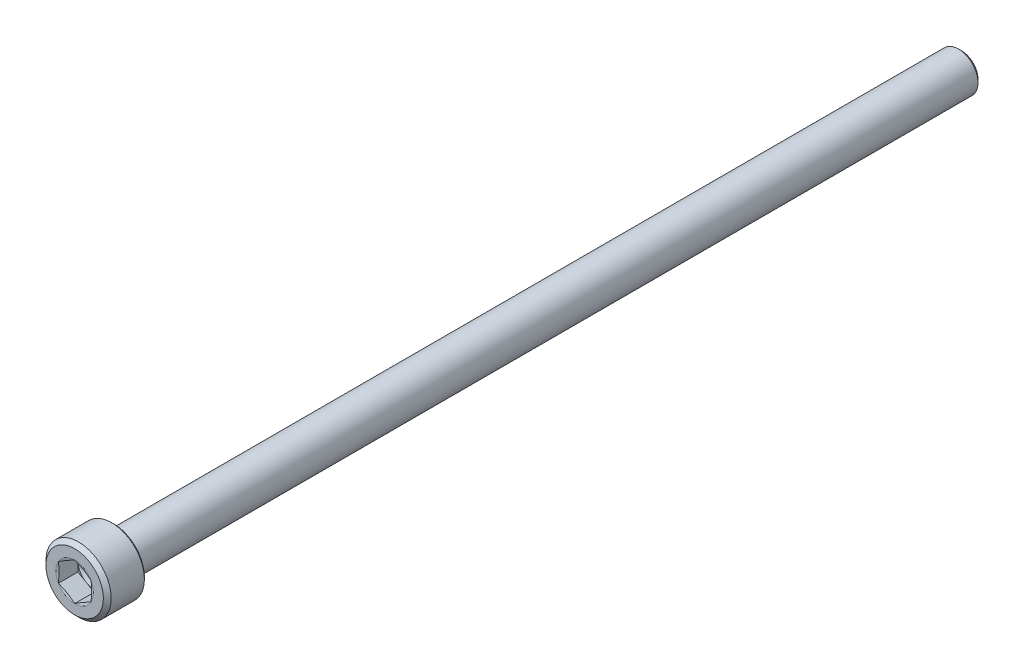
ISO-10303-21;
HEADER;
FILE_DESCRIPTION(('STEP AP214'),'2;1');
FILE_NAME('part.step','',(''),(''),'','','');
FILE_SCHEMA(('AUTOMOTIVE_DESIGN { 1 0 10303 214 1 1 1 1 }'));
ENDSEC;
DATA;
#1=APPLICATION_CONTEXT('core data for automotive mechanical design processes');
#2=APPLICATION_PROTOCOL_DEFINITION('international standard','automotive_design',2000,#1);
#3=PRODUCT_CONTEXT('',#1,'mechanical');
#4=PRODUCT('Part','Part','',(#3));
#5=PRODUCT_RELATED_PRODUCT_CATEGORY('part','',(#4));
#6=PRODUCT_DEFINITION_FORMATION('','',#4);
#7=PRODUCT_DEFINITION_CONTEXT('part definition',#1,'design');
#8=PRODUCT_DEFINITION('design','',#6,#7);
#9=PRODUCT_DEFINITION_SHAPE('','',#8);
#10=(LENGTH_UNIT() NAMED_UNIT(*) SI_UNIT(.MILLI.,.METRE.));
#11=(NAMED_UNIT(*) PLANE_ANGLE_UNIT() SI_UNIT($,.RADIAN.));
#12=(NAMED_UNIT(*) SI_UNIT($,.STERADIAN.) SOLID_ANGLE_UNIT());
#13=UNCERTAINTY_MEASURE_WITH_UNIT(LENGTH_MEASURE(1.E-05),#10,'distance_accuracy_value','');
#14=(GEOMETRIC_REPRESENTATION_CONTEXT(3) GLOBAL_UNCERTAINTY_ASSIGNED_CONTEXT((#13)) GLOBAL_UNIT_ASSIGNED_CONTEXT((#10,
#11,#12)) REPRESENTATION_CONTEXT('',''));
#15=CARTESIAN_POINT('',(0.,0.,0.));
#16=DIRECTION('',(0.,0.,1.));
#17=DIRECTION('',(1.,0.,0.));
#18=AXIS2_PLACEMENT_3D('',#15,#16,#17);
#19=CARTESIAN_POINT('',(0.,0.,0.));
#20=DIRECTION('',(0.,0.,-1.));
#21=DIRECTION('',(-1.,0.,0.));
#22=AXIS2_PLACEMENT_3D('',#19,#20,#21);
#23=PLANE('',#22);
#24=CARTESIAN_POINT('',(0.,0.,0.));
#25=DIRECTION('',(0.,0.,1.));
#26=DIRECTION('',(1.,0.,0.));
#27=AXIS2_PLACEMENT_3D('',#24,#25,#26);
#28=CIRCLE('',#27,4.4);
#29=CARTESIAN_POINT('',(4.4,0.,0.));
#30=VERTEX_POINT('',#29);
#31=EDGE_CURVE('E232',#30,#30,#28,.T.);
#32=ORIENTED_EDGE('',*,*,#31,.T.);
#33=EDGE_LOOP('',(#32));
#34=FACE_BOUND('',#33,.T.);
#35=CARTESIAN_POINT('',(0.,0.,0.));
#36=DIRECTION('',(0.,0.,1.));
#37=DIRECTION('',(1.,0.,0.));
#38=AXIS2_PLACEMENT_3D('',#35,#36,#37);
#39=CIRCLE('',#38,2.88675134594813);
#40=CARTESIAN_POINT('',(-2.5,-1.44337567297407,0.));
#41=VERTEX_POINT('',#40);
#42=CARTESIAN_POINT('',(0.,-2.88675134594813,0.));
#43=VERTEX_POINT('',#42);
#44=EDGE_CURVE('E158',#41,#43,#39,.T.);
#45=ORIENTED_EDGE('',*,*,#44,.F.);
#46=CARTESIAN_POINT('',(-2.5,1.44337567297407,0.));
#47=VERTEX_POINT('',#46);
#48=EDGE_CURVE('E157',#47,#41,#39,.T.);
#49=ORIENTED_EDGE('',*,*,#48,.F.);
#50=CARTESIAN_POINT('',(0.,2.88675134594813,0.));
#51=VERTEX_POINT('',#50);
#52=EDGE_CURVE('E124',#51,#47,#39,.T.);
#53=ORIENTED_EDGE('',*,*,#52,.F.);
#54=CARTESIAN_POINT('',(2.5,1.44337567297407,0.));
#55=VERTEX_POINT('',#54);
#56=EDGE_CURVE('E118',#55,#51,#39,.T.);
#57=ORIENTED_EDGE('',*,*,#56,.F.);
#58=CARTESIAN_POINT('',(2.5,-1.44337567297406,0.));
#59=VERTEX_POINT('',#58);
#60=EDGE_CURVE('E126',#59,#55,#39,.T.);
#61=ORIENTED_EDGE('',*,*,#60,.F.);
#62=EDGE_CURVE('E316',#43,#59,#39,.T.);
#63=ORIENTED_EDGE('',*,*,#62,.F.);
#64=EDGE_LOOP('',(#45,#49,#53,#57,#61,#63));
#65=FACE_BOUND('',#64,.T.);
#66=ADVANCED_FACE('F41',(#34,#65),#23,.F.);
#67=CARTESIAN_POINT('',(0.,0.,-0.599999999999999));
#68=DIRECTION('',(0.,0.,-1.));
#69=DIRECTION('',(-1.,0.,0.));
#70=AXIS2_PLACEMENT_3D('',#67,#68,#69);
#71=CONICAL_SURFACE('',#70,5.,0.78539816339745);
#72=ORIENTED_EDGE('',*,*,#31,.F.);
#73=EDGE_LOOP('',(#72));
#74=FACE_BOUND('',#73,.T.);
#75=CARTESIAN_POINT('',(0.,0.,-0.599999999999999));
#76=DIRECTION('',(0.,0.,1.));
#77=DIRECTION('',(1.,0.,0.));
#78=AXIS2_PLACEMENT_3D('',#75,#76,#77);
#79=CIRCLE('',#78,5.);
#80=CARTESIAN_POINT('',(5.,0.,-0.599999999999999));
#81=VERTEX_POINT('',#80);
#82=EDGE_CURVE('E234',#81,#81,#79,.T.);
#83=ORIENTED_EDGE('',*,*,#82,.T.);
#84=EDGE_LOOP('',(#83));
#85=FACE_BOUND('',#84,.T.);
#86=ADVANCED_FACE('F223',(#74,#85),#71,.T.);
#87=CARTESIAN_POINT('',(0.,0.,0.));
#88=DIRECTION('',(0.,0.,1.));
#89=DIRECTION('',(1.,0.,0.));
#90=AXIS2_PLACEMENT_3D('',#87,#88,#89);
#91=CYLINDRICAL_SURFACE('',#90,5.);
#92=ORIENTED_EDGE('',*,*,#82,.F.);
#93=EDGE_LOOP('',(#92));
#94=FACE_BOUND('',#93,.T.);
#95=CARTESIAN_POINT('',(0.,0.,-5.69));
#96=DIRECTION('',(0.,0.,1.));
#97=DIRECTION('',(1.,0.,0.));
#98=AXIS2_PLACEMENT_3D('',#95,#96,#97);
#99=CIRCLE('',#98,5.);
#100=CARTESIAN_POINT('',(5.,0.,-5.69));
#101=VERTEX_POINT('',#100);
#102=EDGE_CURVE('E237',#101,#101,#99,.T.);
#103=ORIENTED_EDGE('',*,*,#102,.T.);
#104=EDGE_LOOP('',(#103));
#105=FACE_BOUND('',#104,.T.);
#106=ADVANCED_FACE('F228',(#94,#105),#91,.T.);
#107=CARTESIAN_POINT('',(0.,0.,-6.));
#108=DIRECTION('',(0.,0.,1.));
#109=DIRECTION('',(1.,0.,0.));
#110=AXIS2_PLACEMENT_3D('',#107,#108,#109);
#111=CONICAL_SURFACE('',#110,4.69,0.785398163397452);
#112=ORIENTED_EDGE('',*,*,#102,.F.);
#113=EDGE_LOOP('',(#112));
#114=FACE_BOUND('',#113,.T.);
#115=CARTESIAN_POINT('',(0.,0.,-6.));
#116=DIRECTION('',(0.,0.,1.));
#117=DIRECTION('',(1.,0.,0.));
#118=AXIS2_PLACEMENT_3D('',#115,#116,#117);
#119=CIRCLE('',#118,4.69);
#120=CARTESIAN_POINT('',(4.69,0.,-6.));
#121=VERTEX_POINT('',#120);
#122=EDGE_CURVE('E242',#121,#121,#119,.T.);
#123=ORIENTED_EDGE('',*,*,#122,.T.);
#124=EDGE_LOOP('',(#123));
#125=FACE_BOUND('',#124,.T.);
#126=ADVANCED_FACE('F432',(#114,#125),#111,.T.);
#127=CARTESIAN_POINT('',(0.,4.69,-6.));
#128=DIRECTION('',(0.,0.,1.));
#129=DIRECTION('',(1.,0.,0.));
#130=AXIS2_PLACEMENT_3D('',#127,#128,#129);
#131=PLANE('',#130);
#132=ORIENTED_EDGE('',*,*,#122,.F.);
#133=EDGE_LOOP('',(#132));
#134=FACE_BOUND('',#133,.T.);
#135=CARTESIAN_POINT('',(0.,0.,-6.));
#136=DIRECTION('',(0.,0.,1.));
#137=DIRECTION('',(1.,0.,0.));
#138=AXIS2_PLACEMENT_3D('',#135,#136,#137);
#139=CIRCLE('',#138,3.4);
#140=CARTESIAN_POINT('',(3.4,0.,-6.));
#141=VERTEX_POINT('',#140);
#142=EDGE_CURVE('E245',#141,#141,#139,.T.);
#143=ORIENTED_EDGE('',*,*,#142,.T.);
#144=EDGE_LOOP('',(#143));
#145=FACE_BOUND('',#144,.T.);
#146=ADVANCED_FACE('F424',(#134,#145),#131,.F.);
#147=CARTESIAN_POINT('',(0.,0.,-6.25));
#148=DIRECTION('',(0.,0.,1.));
#149=DIRECTION('',(1.,0.,0.));
#150=AXIS2_PLACEMENT_3D('',#147,#148,#149);
#151=TOROIDAL_SURFACE('',#150,3.4,0.249999999999999);
#152=ORIENTED_EDGE('',*,*,#142,.F.);
#153=EDGE_LOOP('',(#152));
#154=FACE_BOUND('',#153,.T.);
#155=CARTESIAN_POINT('',(0.,0.,-6.16765696092043));
#156=DIRECTION('',(0.,0.,1.));
#157=DIRECTION('',(1.,0.,0.));
#158=AXIS2_PLACEMENT_3D('',#155,#156,#157);
#159=CIRCLE('',#158,3.16394995463856);
#160=CARTESIAN_POINT('',(3.16394995463856,0.,-6.16765696092043));
#161=VERTEX_POINT('',#160);
#162=EDGE_CURVE('E248',#161,#161,#159,.T.);
#163=ORIENTED_EDGE('',*,*,#162,.T.);
#164=EDGE_LOOP('',(#163));
#165=FACE_BOUND('',#164,.T.);
#166=ADVANCED_FACE('F416',(#154,#165),#151,.F.);
#167=CARTESIAN_POINT('',(0.,0.,-6.59765696092043));
#168=DIRECTION('',(0.,0.,1.));
#169=DIRECTION('',(1.,0.,0.));
#170=AXIS2_PLACEMENT_3D('',#167,#168,#169);
#171=CONICAL_SURFACE('',#170,3.01394995463856,0.335638550327612);
#172=ORIENTED_EDGE('',*,*,#162,.F.);
#173=EDGE_LOOP('',(#172));
#174=FACE_BOUND('',#173,.T.);
#175=CARTESIAN_POINT('',(0.,0.,-6.59765696092043));
#176=DIRECTION('',(0.,0.,1.));
#177=DIRECTION('',(1.,0.,0.));
#178=AXIS2_PLACEMENT_3D('',#175,#176,#177);
#179=CIRCLE('',#178,3.01394995463856);
#180=CARTESIAN_POINT('',(3.01394995463856,0.,-6.59765696092043));
#181=VERTEX_POINT('',#180);
#182=EDGE_CURVE('E251',#181,#181,#179,.T.);
#183=ORIENTED_EDGE('',*,*,#182,.T.);
#184=EDGE_LOOP('',(#183));
#185=FACE_BOUND('',#184,.T.);
#186=ADVANCED_FACE('F408',(#174,#185),#171,.T.);
#187=CARTESIAN_POINT('',(0.,0.,-6.68));
#188=DIRECTION('',(0.,0.,1.));
#189=DIRECTION('',(1.,0.,0.));
#190=AXIS2_PLACEMENT_3D('',#187,#188,#189);
#191=TOROIDAL_SURFACE('',#190,3.25,0.25);
#192=ORIENTED_EDGE('',*,*,#182,.F.);
#193=EDGE_LOOP('',(#192));
#194=FACE_BOUND('',#193,.T.);
#195=CARTESIAN_POINT('',(0.,0.,-6.68));
#196=DIRECTION('',(0.,0.,1.));
#197=DIRECTION('',(1.,0.,0.));
#198=AXIS2_PLACEMENT_3D('',#195,#196,#197);
#199=CIRCLE('',#198,3.);
#200=CARTESIAN_POINT('',(3.,0.,-6.68));
#201=VERTEX_POINT('',#200);
#202=EDGE_CURVE('E254',#201,#201,#199,.T.);
#203=ORIENTED_EDGE('',*,*,#202,.T.);
#204=EDGE_LOOP('',(#203));
#205=FACE_BOUND('',#204,.T.);
#206=ADVANCED_FACE('F400',(#194,#205),#191,.F.);
#207=CARTESIAN_POINT('',(0.,0.,0.));
#208=DIRECTION('',(0.,0.,1.));
#209=DIRECTION('',(1.,0.,0.));
#210=AXIS2_PLACEMENT_3D('',#207,#208,#209);
#211=CYLINDRICAL_SURFACE('',#210,3.);
#212=ORIENTED_EDGE('',*,*,#202,.F.);
#213=EDGE_LOOP('',(#212));
#214=FACE_BOUND('',#213,.T.);
#215=CARTESIAN_POINT('',(0.,0.,-135.5));
#216=DIRECTION('',(0.,0.,1.));
#217=DIRECTION('',(1.,0.,0.));
#218=AXIS2_PLACEMENT_3D('',#215,#216,#217);
#219=CIRCLE('',#218,3.);
#220=CARTESIAN_POINT('',(3.,0.,-135.5));
#221=VERTEX_POINT('',#220);
#222=EDGE_CURVE('E257',#221,#221,#219,.T.);
#223=ORIENTED_EDGE('',*,*,#222,.T.);
#224=EDGE_LOOP('',(#223));
#225=FACE_BOUND('',#224,.T.);
#226=ADVANCED_FACE('F391',(#214,#225),#211,.T.);
#227=CARTESIAN_POINT('',(0.,0.,-136.));
#228=DIRECTION('',(0.,0.,1.));
#229=DIRECTION('',(1.,0.,0.));
#230=AXIS2_PLACEMENT_3D('',#227,#228,#229);
#231=CONICAL_SURFACE('',#230,2.5,0.78539816339742);
#232=ORIENTED_EDGE('',*,*,#222,.F.);
#233=EDGE_LOOP('',(#232));
#234=FACE_BOUND('',#233,.T.);
#235=CARTESIAN_POINT('',(0.,0.,-136.));
#236=DIRECTION('',(0.,0.,1.));
#237=DIRECTION('',(1.,0.,0.));
#238=AXIS2_PLACEMENT_3D('',#235,#236,#237);
#239=CIRCLE('',#238,2.5);
#240=CARTESIAN_POINT('',(2.5,0.,-136.));
#241=VERTEX_POINT('',#240);
#242=EDGE_CURVE('E260',#241,#241,#239,.T.);
#243=ORIENTED_EDGE('',*,*,#242,.T.);
#244=EDGE_LOOP('',(#243));
#245=FACE_BOUND('',#244,.T.);
#246=ADVANCED_FACE('F383',(#234,#245),#231,.T.);
#247=CARTESIAN_POINT('',(0.,2.5,-136.));
#248=DIRECTION('',(0.,0.,1.));
#249=DIRECTION('',(1.,0.,0.));
#250=AXIS2_PLACEMENT_3D('',#247,#248,#249);
#251=PLANE('',#250);
#252=ORIENTED_EDGE('',*,*,#242,.F.);
#253=EDGE_LOOP('',(#252));
#254=FACE_BOUND('',#253,.T.);
#255=ADVANCED_FACE('F377',(#254),#251,.F.);
#256=CARTESIAN_POINT('',(0.,0.,-0.103629710818449));
#257=DIRECTION('',(0.,0.,1.));
#258=DIRECTION('',(1.,0.,0.));
#259=AXIS2_PLACEMENT_3D('',#256,#257,#258);
#260=CONICAL_SURFACE('',#259,2.5,1.30899693899575);
#261=ORIENTED_EDGE('',*,*,#52,.T.);
#262=CARTESIAN_POINT('',(-2.5002,1.44326020292023,3.09419640078327E-05));
#263=CARTESIAN_POINT('',(-2.3963647277611,1.50320952529874,-0.0160404315877912));
#264=CARTESIAN_POINT('',(-2.29234116960921,1.56326755459979,-0.0306306771178117));
#265=CARTESIAN_POINT('',(-2.08392662601295,1.68359574744812,-0.0562644794602667));
#266=CARTESIAN_POINT('',(-1.97953550863948,1.74386598716471,-0.0673065951638286));
#267=CARTESIAN_POINT('',(-1.77101887822002,1.8642531198679,-0.0851994090604318));
#268=CARTESIAN_POINT('',(-1.66689477566614,1.9243691985065,-0.0920714486702324));
#269=CARTESIAN_POINT('',(-1.45851376233156,2.04467803264923,-0.101286161227743));
#270=CARTESIAN_POINT('',(-1.35425688116578,2.10487077105516,-0.103629710818448));
#271=CARTESIAN_POINT('',(-1.14574311883422,2.22525624786703,-0.103629710818448));
#272=CARTESIAN_POINT('',(-1.04148623766843,2.28544898627297,-0.101286161227743));
#273=CARTESIAN_POINT('',(-0.833105224333855,2.4057578204157,-0.0920714486702323));
#274=CARTESIAN_POINT('',(-0.728981121779983,2.4658738990543,-0.0851994090604318));
#275=CARTESIAN_POINT('',(-0.520464491360523,2.58626103175749,-0.0673065951638284));
#276=CARTESIAN_POINT('',(-0.416073373987047,2.64653127147407,-0.0562644794602665));
#277=CARTESIAN_POINT('',(-0.207658830390791,2.7668594643224,-0.0306306771178115));
#278=CARTESIAN_POINT('',(-0.103635272238903,2.82691749362346,-0.016040431587791));
#279=CARTESIAN_POINT('',(0.000200000000000633,2.88686681600197,3.09419640079173E-05));
#280=B_SPLINE_CURVE_WITH_KNOTS('',3,(#262,#263,#264,#265,#266,#267,#268,#269,#270,#271,#272,
#273,#274,#275,#276,#277,#278,#279),.UNSPECIFIED.,.F.,.F.,(4,2,2,2,2,2,2,2,4),(0.,
0.362931913815158,0.726011050322838,1.08721601235603,1.44835104389736,1.80948607543869,
2.17069103747188,2.53377017397956,2.89670208779472),.UNSPECIFIED.);
#281=EDGE_CURVE('E11',#47,#51,#280,.T.);
#282=ORIENTED_EDGE('',*,*,#281,.T.);
#283=EDGE_LOOP('',(#261,#282));
#284=FACE_BOUND('',#283,.T.);
#285=ADVANCED_FACE('F130',(#284),#260,.F.);
#286=CARTESIAN_POINT('',(-2.5,-3.81607528745377,0.448898750822263));
#287=CARTESIAN_POINT('',(-2.5,-3.70268222589733,0.423490022888473));
#288=CARTESIAN_POINT('',(-2.5,-3.58921822823278,0.398392881364473));
#289=CARTESIAN_POINT('',(-2.5,-3.36211340745449,0.348988750788404));
#290=CARTESIAN_POINT('',(-2.5,-3.24847257691113,0.324681795929632));
#291=CARTESIAN_POINT('',(-2.5,-3.02087703769944,0.277003803109804));
#292=CARTESIAN_POINT('',(-2.5,-2.90692213022999,0.253633709391547));
#293=CARTESIAN_POINT('',(-2.5,-2.67877535679218,0.208086780880581));
#294=CARTESIAN_POINT('',(-2.5,-2.56458349283676,0.185909935993961));
#295=CARTESIAN_POINT('',(-2.5,-2.22341982425459,0.121910877106936));
#296=CARTESIAN_POINT('',(-2.5,-1.99603830218398,0.0822302229364124));
#297=CARTESIAN_POINT('',(-2.5,-1.53988771892966,0.0116720496175827));
#298=CARTESIAN_POINT('',(-2.5,-1.31111890637465,-0.0192070019485673));
#299=CARTESIAN_POINT('',(-2.5,-0.965612085480585,-0.0559642465078483));
#300=CARTESIAN_POINT('',(-2.5,-0.849388361737326,-0.0666558282512374));
#301=CARTESIAN_POINT('',(-2.5,-0.616655377132936,-0.0842009570846986));
#302=CARTESIAN_POINT('',(-2.5,-0.500146141574661,-0.0910548327485627));
#303=CARTESIAN_POINT('',(-2.5,-0.267001550599814,-0.100527089710495));
#304=CARTESIAN_POINT('',(-2.5,-0.150366269056388,-0.103147255321986));
#305=CARTESIAN_POINT('',(-2.5,0.0829204090002316,-0.10399028327093));
#306=CARTESIAN_POINT('',(-2.5,0.199571805500895,-0.102213149008376));
#307=CARTESIAN_POINT('',(-2.5,0.433147940164822,-0.09436195748554));
#308=CARTESIAN_POINT('',(-2.5,0.550072149359405,-0.0882724452898564));
#309=CARTESIAN_POINT('',(-2.5,0.783651629721234,-0.0721426206173039));
#310=CARTESIAN_POINT('',(-2.5,0.900306876564898,-0.0621019639074798));
#311=CARTESIAN_POINT('',(-2.5,1.24987827661572,-0.0268172856222201));
#312=CARTESIAN_POINT('',(-2.5,1.48227255568164,0.00358412310984416));
#313=CARTESIAN_POINT('',(-2.5,1.93002655518119,0.0714138007905057));
#314=CARTESIAN_POINT('',(-2.5,2.14548347256994,0.108234090127695));
#315=CARTESIAN_POINT('',(-2.5,2.57541124173799,0.187324733638172));
#316=CARTESIAN_POINT('',(-2.5,2.78988196550051,0.229595775775308));
#317=CARTESIAN_POINT('',(-2.5,3.2181052382832,0.317793502316737));
#318=CARTESIAN_POINT('',(-2.5,3.43185763378042,0.363720922081292));
#319=CARTESIAN_POINT('',(-2.5,3.85881275448637,0.458069959265328));
#320=CARTESIAN_POINT('',(-2.5,4.07201546822918,0.506491628277899));
#321=CARTESIAN_POINT('',(-2.5,4.49591231305092,0.604599288732733));
#322=CARTESIAN_POINT('',(-2.5,4.70661044026336,0.654268092023149));
#323=CARTESIAN_POINT('',(-2.5,5.12771281191888,0.754849972800793));
#324=CARTESIAN_POINT('',(-2.5,5.33811705095724,0.80576307286073));
#325=CARTESIAN_POINT('',(-2.5,5.75844185155037,0.908445331221202));
#326=CARTESIAN_POINT('',(-2.5,5.96836268971444,0.960213359733673));
#327=CARTESIAN_POINT('',(-2.5,6.38802143165175,1.06445683710807));
#328=CARTESIAN_POINT('',(-2.5,6.59775934122022,1.11693226262348));
#329=CARTESIAN_POINT('',(-2.5,6.80743348121522,1.16965832285731));
#330=B_SPLINE_CURVE_WITH_KNOTS('',3,(#286,#287,#288,#289,#290,#291,#292,#293,#294,#295,#296,
#297,#298,#299,#300,#301,#302,#303,#304,#305,#306,#307,#308,#309,#310,#311,#312,#313,#314,#315,
#316,#317,#318,#319,#320,#321,#322,#323,#324,#325,#326,#327,#328,#329),.UNSPECIFIED.,.F.,.F.,(4,
2,2,2,2,2,2,2,2,2,2,2,2,2,2,2,2,2,2,2,2,4),(0.,0.348615963150093,0.697246991733421,
1.04622099004378,1.39519203585453,2.08754680874317,2.77978096430401,3.12987133055866,
3.47993171845836,3.82984453354037,4.17975707806977,4.53093004646434,4.88213361664562,
5.58492300307792,6.24058068113987,6.89632119383297,7.55219392197656,8.20808022217989,
8.85749522889879,9.50692202537157,10.155550152628,10.8041569250998),.UNSPECIFIED.);
#331=EDGE_CURVE('E123',#41,#47,#330,.T.);
#332=ORIENTED_EDGE('',*,*,#331,.T.);
#333=ORIENTED_EDGE('',*,*,#48,.T.);
#334=EDGE_LOOP('',(#332,#333));
#335=FACE_BOUND('',#334,.T.);
#336=ADVANCED_FACE('F364',(#335),#260,.F.);
#337=CARTESIAN_POINT('',(0.000199999999999656,-2.88686681600197,3.09419640072472E-05));
#338=CARTESIAN_POINT('',(-0.103635272238904,-2.82691749362346,-0.0160404315877918));
#339=CARTESIAN_POINT('',(-0.207658830390792,-2.7668594643224,-0.0306306771178123));
#340=CARTESIAN_POINT('',(-0.416073373987048,-2.64653127147407,-0.0562644794602673));
#341=CARTESIAN_POINT('',(-0.520464491360523,-2.58626103175749,-0.0673065951638292));
#342=CARTESIAN_POINT('',(-0.728981121779984,-2.4658738990543,-0.0851994090604324));
#343=CARTESIAN_POINT('',(-0.833105224333855,-2.40575782041569,-0.0920714486702329));
#344=CARTESIAN_POINT('',(-1.04148623766843,-2.28544898627297,-0.101286161227744));
#345=CARTESIAN_POINT('',(-1.14574311883422,-2.22525624786703,-0.103629710818449));
#346=CARTESIAN_POINT('',(-1.35425688116578,-2.10487077105516,-0.103629710818449));
#347=CARTESIAN_POINT('',(-1.45851376233157,-2.04467803264922,-0.101286161227744));
#348=CARTESIAN_POINT('',(-1.66689477566614,-1.9243691985065,-0.092071448670233));
#349=CARTESIAN_POINT('',(-1.77101887822002,-1.86425311986789,-0.0851994090604324));
#350=CARTESIAN_POINT('',(-1.97953550863948,-1.7438659871647,-0.0673065951638292));
#351=CARTESIAN_POINT('',(-2.08392662601295,-1.68359574744812,-0.0562644794602673));
#352=CARTESIAN_POINT('',(-2.29234116960921,-1.56326755459979,-0.0306306771178123));
#353=CARTESIAN_POINT('',(-2.3963647277611,-1.50320952529873,-0.0160404315877917));
#354=CARTESIAN_POINT('',(-2.5002,-1.44326020292023,3.0941964007367E-05));
#355=B_SPLINE_CURVE_WITH_KNOTS('',3,(#337,#338,#339,#340,#341,#342,#343,#344,#345,#346,#347,
#348,#349,#350,#351,#352,#353,#354),.UNSPECIFIED.,.F.,.F.,(4,2,2,2,2,2,2,2,4),(0.,
0.362931913815158,0.726011050322838,1.08721601235603,1.44835104389736,1.80948607543869,
2.17069103747188,2.53377017397956,2.89670208779472),.UNSPECIFIED.);
#356=EDGE_CURVE('E166',#43,#41,#355,.T.);
#357=ORIENTED_EDGE('',*,*,#356,.T.);
#358=ORIENTED_EDGE('',*,*,#44,.T.);
#359=EDGE_LOOP('',(#357,#358));
#360=FACE_BOUND('',#359,.T.);
#361=ADVANCED_FACE('F358',(#360),#260,.F.);
#362=CARTESIAN_POINT('',(2.5002,-1.44326020292023,3.09419640074895E-05));
#363=CARTESIAN_POINT('',(2.3963647277611,-1.50320952529874,-0.0160404315877914));
#364=CARTESIAN_POINT('',(2.29234116960921,-1.56326755459979,-0.030630677117812));
#365=CARTESIAN_POINT('',(2.08392662601295,-1.68359574744812,-0.0562644794602671));
#366=CARTESIAN_POINT('',(1.97953550863948,-1.7438659871647,-0.067306595163829));
#367=CARTESIAN_POINT('',(1.77101887822002,-1.86425311986789,-0.0851994090604323));
#368=CARTESIAN_POINT('',(1.66689477566614,-1.9243691985065,-0.0920714486702328));
#369=CARTESIAN_POINT('',(1.45851376233157,-2.04467803264922,-0.101286161227744));
#370=CARTESIAN_POINT('',(1.35425688116578,-2.10487077105516,-0.103629710818449));
#371=CARTESIAN_POINT('',(1.14574311883422,-2.22525624786703,-0.103629710818449));
#372=CARTESIAN_POINT('',(1.04148623766843,-2.28544898627297,-0.101286161227744));
#373=CARTESIAN_POINT('',(0.833105224333855,-2.40575782041569,-0.0920714486702329));
#374=CARTESIAN_POINT('',(0.728981121779984,-2.4658738990543,-0.0851994090604324));
#375=CARTESIAN_POINT('',(0.520464491360523,-2.58626103175749,-0.0673065951638292));
#376=CARTESIAN_POINT('',(0.416073373987048,-2.64653127147407,-0.0562644794602673));
#377=CARTESIAN_POINT('',(0.207658830390792,-2.7668594643224,-0.0306306771178124));
#378=CARTESIAN_POINT('',(0.103635272238904,-2.82691749362346,-0.0160404315877919));
#379=CARTESIAN_POINT('',(-0.000199999999999934,-2.88686681600197,3.09419640071601E-05));
#380=B_SPLINE_CURVE_WITH_KNOTS('',3,(#362,#363,#364,#365,#366,#367,#368,#369,#370,#371,#372,
#373,#374,#375,#376,#377,#378,#379),.UNSPECIFIED.,.F.,.F.,(4,2,2,2,2,2,2,2,4),(0.,
0.362931913815159,0.726011050322838,1.08721601235603,1.44835104389736,1.80948607543869,
2.17069103747188,2.53377017397956,2.89670208779472),.UNSPECIFIED.);
#381=EDGE_CURVE('E186',#59,#43,#380,.T.);
#382=ORIENTED_EDGE('',*,*,#381,.T.);
#383=ORIENTED_EDGE('',*,*,#62,.T.);
#384=EDGE_LOOP('',(#382,#383));
#385=FACE_BOUND('',#384,.T.);
#386=ADVANCED_FACE('F352',(#385),#260,.F.);
#387=CARTESIAN_POINT('',(2.5,-3.81607528745378,0.448898750822263));
#388=CARTESIAN_POINT('',(2.5,-3.70268222589733,0.423490022888473));
#389=CARTESIAN_POINT('',(2.5,-3.58921822823278,0.398392881364473));
#390=CARTESIAN_POINT('',(2.5,-3.36211340745449,0.348988750788405));
#391=CARTESIAN_POINT('',(2.5,-3.24847257691113,0.324681795929633));
#392=CARTESIAN_POINT('',(2.5,-3.02087703769944,0.277003803109804));
#393=CARTESIAN_POINT('',(2.5,-2.90692213023,0.253633709391547));
#394=CARTESIAN_POINT('',(2.5,-2.67877535679218,0.208086780880582));
#395=CARTESIAN_POINT('',(2.5,-2.56458349283676,0.185909935993962));
#396=CARTESIAN_POINT('',(2.5,-2.22341982425459,0.121910877106936));
#397=CARTESIAN_POINT('',(2.5,-1.99603830218398,0.0822302229364126));
#398=CARTESIAN_POINT('',(2.5,-1.53988771892967,0.0116720496175827));
#399=CARTESIAN_POINT('',(2.5,-1.31111890637465,-0.0192070019485672));
#400=CARTESIAN_POINT('',(2.5,-0.965612085480586,-0.0559642465078481));
#401=CARTESIAN_POINT('',(2.5,-0.849388361737327,-0.0666558282512373));
#402=CARTESIAN_POINT('',(2.5,-0.616655377132937,-0.0842009570846985));
#403=CARTESIAN_POINT('',(2.5,-0.500146141574662,-0.0910548327485627));
#404=CARTESIAN_POINT('',(2.5,-0.267001550599815,-0.100527089710495));
#405=CARTESIAN_POINT('',(2.5,-0.150366269056389,-0.103147255321986));
#406=CARTESIAN_POINT('',(2.5,0.0829204090002306,-0.10399028327093));
#407=CARTESIAN_POINT('',(2.5,0.199571805500894,-0.102213149008376));
#408=CARTESIAN_POINT('',(2.5,0.433147940164821,-0.09436195748554));
#409=CARTESIAN_POINT('',(2.5,0.550072149359404,-0.0882724452898564));
#410=CARTESIAN_POINT('',(2.5,0.783651629721233,-0.0721426206173039));
#411=CARTESIAN_POINT('',(2.5,0.900306876564897,-0.0621019639074799));
#412=CARTESIAN_POINT('',(2.5,1.24987827661571,-0.0268172856222202));
#413=CARTESIAN_POINT('',(2.5,1.48227255568164,0.00358412310984413));
#414=CARTESIAN_POINT('',(2.5,1.93002655518119,0.0714138007905059));
#415=CARTESIAN_POINT('',(2.5,2.14548347256994,0.108234090127695));
#416=CARTESIAN_POINT('',(2.5,2.57541124173799,0.187324733638172));
#417=CARTESIAN_POINT('',(2.5,2.78988196550051,0.229595775775308));
#418=CARTESIAN_POINT('',(2.5,3.21810523828321,0.317793502316737));
#419=CARTESIAN_POINT('',(2.5,3.43185763378042,0.363720922081293));
#420=CARTESIAN_POINT('',(2.5,3.85881275448638,0.458069959265329));
#421=CARTESIAN_POINT('',(2.5,4.07201546822918,0.5064916282779));
#422=CARTESIAN_POINT('',(2.5,4.49591231305093,0.604599288732734));
#423=CARTESIAN_POINT('',(2.5,4.70661044026336,0.65426809202315));
#424=CARTESIAN_POINT('',(2.5,5.12771281191888,0.754849972800793));
#425=CARTESIAN_POINT('',(2.5,5.33811705095724,0.80576307286073));
#426=CARTESIAN_POINT('',(2.5,5.75844185155038,0.908445331221202));
#427=CARTESIAN_POINT('',(2.5,5.96836268971444,0.960213359733673));
#428=CARTESIAN_POINT('',(2.5,6.38802143165175,1.06445683710807));
#429=CARTESIAN_POINT('',(2.5,6.59775934122022,1.11693226262348));
#430=CARTESIAN_POINT('',(2.5,6.80743348121522,1.16965832285731));
#431=B_SPLINE_CURVE_WITH_KNOTS('',3,(#387,#388,#389,#390,#391,#392,#393,#394,#395,#396,#397,
#398,#399,#400,#401,#402,#403,#404,#405,#406,#407,#408,#409,#410,#411,#412,#413,#414,#415,#416,
#417,#418,#419,#420,#421,#422,#423,#424,#425,#426,#427,#428,#429,#430),.UNSPECIFIED.,.F.,.F.,(4,
2,2,2,2,2,2,2,2,2,2,2,2,2,2,2,2,2,2,2,2,4),(0.,0.348615963150093,0.697246991733421,
1.04622099004378,1.39519203585453,2.08754680874317,2.77978096430401,3.12987133055866,
3.47993171845836,3.82984453354037,4.17975707806977,4.53093004646434,4.88213361664562,
5.58492300307792,6.24058068113987,6.89632119383297,7.55219392197657,8.20808022217989,
8.85749522889879,9.50692202537157,10.155550152628,10.8041569250998),.UNSPECIFIED.);
#432=EDGE_CURVE('E66',#55,#59,#431,.F.);
#433=ORIENTED_EDGE('',*,*,#432,.T.);
#434=ORIENTED_EDGE('',*,*,#60,.T.);
#435=EDGE_LOOP('',(#433,#434));
#436=FACE_BOUND('',#435,.T.);
#437=ADVANCED_FACE('F179',(#436),#260,.F.);
#438=CARTESIAN_POINT('',(-0.000199999999999234,2.88686681600197,3.09419640079894E-05));
#439=CARTESIAN_POINT('',(0.103635272238905,2.82691749362346,-0.0160404315877909));
#440=CARTESIAN_POINT('',(0.207658830390793,2.7668594643224,-0.0306306771178115));
#441=CARTESIAN_POINT('',(0.416073373987049,2.64653127147407,-0.0562644794602665));
#442=CARTESIAN_POINT('',(0.520464491360524,2.58626103175749,-0.0673065951638284));
#443=CARTESIAN_POINT('',(0.728981121779984,2.4658738990543,-0.0851994090604317));
#444=CARTESIAN_POINT('',(0.833105224333856,2.4057578204157,-0.0920714486702322));
#445=CARTESIAN_POINT('',(1.04148623766844,2.28544898627297,-0.101286161227743));
#446=CARTESIAN_POINT('',(1.14574311883422,2.22525624786703,-0.103629710818448));
#447=CARTESIAN_POINT('',(1.35425688116578,2.10487077105516,-0.103629710818448));
#448=CARTESIAN_POINT('',(1.45851376233157,2.04467803264923,-0.101286161227743));
#449=CARTESIAN_POINT('',(1.66689477566614,1.9243691985065,-0.0920714486702323));
#450=CARTESIAN_POINT('',(1.77101887822002,1.8642531198679,-0.0851994090604318));
#451=CARTESIAN_POINT('',(1.97953550863948,1.74386598716471,-0.0673065951638286));
#452=CARTESIAN_POINT('',(2.08392662601295,1.68359574744812,-0.0562644794602666));
#453=CARTESIAN_POINT('',(2.29234116960921,1.56326755459979,-0.0306306771178116));
#454=CARTESIAN_POINT('',(2.3963647277611,1.50320952529874,-0.016040431587791));
#455=CARTESIAN_POINT('',(2.5002,1.44326020292023,3.09419640078353E-05));
#456=B_SPLINE_CURVE_WITH_KNOTS('',3,(#438,#439,#440,#441,#442,#443,#444,#445,#446,#447,#448,
#449,#450,#451,#452,#453,#454,#455),.UNSPECIFIED.,.F.,.F.,(4,2,2,2,2,2,2,2,4),(0.,
0.362931913815158,0.726011050322838,1.08721601235603,1.44835104389736,1.80948607543869,
2.17069103747188,2.53377017397956,2.89670208779472),.UNSPECIFIED.);
#457=EDGE_CURVE('E60',#51,#55,#456,.T.);
#458=ORIENTED_EDGE('',*,*,#457,.T.);
#459=ORIENTED_EDGE('',*,*,#56,.T.);
#460=EDGE_LOOP('',(#458,#459));
#461=FACE_BOUND('',#460,.T.);
#462=ADVANCED_FACE('F119',(#461),#260,.F.);
#463=CARTESIAN_POINT('',(0.,0.,-4.44337567297406));
#464=DIRECTION('',(0.,0.,1.));
#465=DIRECTION('',(1.,0.,0.));
#466=AXIS2_PLACEMENT_3D('',#463,#464,#465);
#467=CONICAL_SURFACE('',#466,0.,1.0471975511966);
#468=CARTESIAN_POINT('',(0.,0.,-3.));
#469=DIRECTION('',(0.,0.,1.));
#470=DIRECTION('',(1.,0.,0.));
#471=AXIS2_PLACEMENT_3D('',#468,#469,#470);
#472=CIRCLE('',#471,2.5);
#473=CARTESIAN_POINT('',(2.5,0.,-3.));
#474=VERTEX_POINT('',#473);
#475=CARTESIAN_POINT('',(1.25,2.1650635094611,-3.));
#476=VERTEX_POINT('',#475);
#477=EDGE_CURVE('E146',#474,#476,#472,.T.);
#478=ORIENTED_EDGE('',*,*,#477,.T.);
#479=CARTESIAN_POINT('',(-1.25,2.1650635094611,-3.));
#480=VERTEX_POINT('',#479);
#481=EDGE_CURVE('E54',#476,#480,#472,.T.);
#482=ORIENTED_EDGE('',*,*,#481,.T.);
#483=CARTESIAN_POINT('',(-2.5,0.,-3.));
#484=VERTEX_POINT('',#483);
#485=EDGE_CURVE('E297',#480,#484,#472,.T.);
#486=ORIENTED_EDGE('',*,*,#485,.T.);
#487=CARTESIAN_POINT('',(-1.25,-2.1650635094611,-3.));
#488=VERTEX_POINT('',#487);
#489=EDGE_CURVE('E299',#484,#488,#472,.T.);
#490=ORIENTED_EDGE('',*,*,#489,.T.);
#491=CARTESIAN_POINT('',(1.25,-2.1650635094611,-3.));
#492=VERTEX_POINT('',#491);
#493=EDGE_CURVE('E235',#488,#492,#472,.T.);
#494=ORIENTED_EDGE('',*,*,#493,.T.);
#495=EDGE_CURVE('E233',#492,#474,#472,.T.);
#496=ORIENTED_EDGE('',*,*,#495,.T.);
#497=EDGE_LOOP('',(#478,#482,#486,#490,#494,#496));
#498=FACE_BOUND('',#497,.T.);
#499=CARTESIAN_POINT('',(0.,0.,-4.44337567297406));
#500=VERTEX_POINT('',#499);
#501=VERTEX_LOOP('',#500);
#502=FACE_BOUND('',#501,.T.);
#503=ADVANCED_FACE('F178',(#498,#502),#467,.F.);
#504=CARTESIAN_POINT('',(0.,0.,-3.));
#505=DIRECTION('',(0.,0.,1.));
#506=DIRECTION('',(1.,0.,0.));
#507=AXIS2_PLACEMENT_3D('',#504,#505,#506);
#508=PLANE('',#507);
#509=ORIENTED_EDGE('',*,*,#477,.F.);
#510=DIRECTION('',(0.,1.,0.));
#511=VECTOR('',#510,1.);
#512=CARTESIAN_POINT('',(2.5,-1.44337567297406,-3.));
#513=LINE('',#512,#511);
#514=CARTESIAN_POINT('',(2.5,1.44337567297407,-3.));
#515=VERTEX_POINT('',#514);
#516=EDGE_CURVE('E276',#474,#515,#513,.T.);
#517=ORIENTED_EDGE('',*,*,#516,.T.);
#518=DIRECTION('',(-0.866025403784439,0.5,0.));
#519=VECTOR('',#518,1.);
#520=CARTESIAN_POINT('',(2.5,1.44337567297407,-3.));
#521=LINE('',#520,#519);
#522=EDGE_CURVE('E291',#515,#476,#521,.T.);
#523=ORIENTED_EDGE('',*,*,#522,.T.);
#524=EDGE_LOOP('',(#509,#517,#523));
#525=FACE_BOUND('',#524,.T.);
#526=ADVANCED_FACE('F321',(#525),#508,.T.);
#527=ORIENTED_EDGE('',*,*,#495,.F.);
#528=DIRECTION('',(0.866025403784439,0.5,0.));
#529=VECTOR('',#528,1.);
#530=CARTESIAN_POINT('',(0.,-2.88675134594813,-3.));
#531=LINE('',#530,#529);
#532=CARTESIAN_POINT('',(2.5,-1.44337567297406,-3.));
#533=VERTEX_POINT('',#532);
#534=EDGE_CURVE('E280',#492,#533,#531,.T.);
#535=ORIENTED_EDGE('',*,*,#534,.T.);
#536=EDGE_CURVE('E153',#533,#474,#513,.T.);
#537=ORIENTED_EDGE('',*,*,#536,.T.);
#538=EDGE_LOOP('',(#527,#535,#537));
#539=FACE_BOUND('',#538,.T.);
#540=ADVANCED_FACE('F209',(#539),#508,.T.);
#541=ORIENTED_EDGE('',*,*,#493,.F.);
#542=DIRECTION('',(0.866025403784439,-0.5,0.));
#543=VECTOR('',#542,1.);
#544=CARTESIAN_POINT('',(-2.5,-1.44337567297406,-3.));
#545=LINE('',#544,#543);
#546=CARTESIAN_POINT('',(0.,-2.88675134594813,-3.));
#547=VERTEX_POINT('',#546);
#548=EDGE_CURVE('E284',#488,#547,#545,.T.);
#549=ORIENTED_EDGE('',*,*,#548,.T.);
#550=EDGE_CURVE('E277',#547,#492,#531,.T.);
#551=ORIENTED_EDGE('',*,*,#550,.T.);
#552=EDGE_LOOP('',(#541,#549,#551));
#553=FACE_BOUND('',#552,.T.);
#554=ADVANCED_FACE('F312',(#553),#508,.T.);
#555=ORIENTED_EDGE('',*,*,#489,.F.);
#556=DIRECTION('',(0.,-1.,0.));
#557=VECTOR('',#556,1.);
#558=CARTESIAN_POINT('',(-2.5,1.44337567297407,-3.));
#559=LINE('',#558,#557);
#560=CARTESIAN_POINT('',(-2.5,-1.44337567297406,-3.));
#561=VERTEX_POINT('',#560);
#562=EDGE_CURVE('E288',#484,#561,#559,.T.);
#563=ORIENTED_EDGE('',*,*,#562,.T.);
#564=EDGE_CURVE('E281',#561,#488,#545,.T.);
#565=ORIENTED_EDGE('',*,*,#564,.T.);
#566=EDGE_LOOP('',(#555,#563,#565));
#567=FACE_BOUND('',#566,.T.);
#568=ADVANCED_FACE('F326',(#567),#508,.T.);
#569=ORIENTED_EDGE('',*,*,#481,.F.);
#570=CARTESIAN_POINT('',(0.,2.88675134594813,-3.));
#571=VERTEX_POINT('',#570);
#572=EDGE_CURVE('E293',#476,#571,#521,.T.);
#573=ORIENTED_EDGE('',*,*,#572,.T.);
#574=DIRECTION('',(-0.866025403784439,-0.5,0.));
#575=VECTOR('',#574,1.);
#576=CARTESIAN_POINT('',(0.,2.88675134594813,-3.));
#577=LINE('',#576,#575);
#578=EDGE_CURVE('E151',#571,#480,#577,.T.);
#579=ORIENTED_EDGE('',*,*,#578,.T.);
#580=EDGE_LOOP('',(#569,#573,#579));
#581=FACE_BOUND('',#580,.T.);
#582=ADVANCED_FACE('F323',(#581),#508,.T.);
#583=ORIENTED_EDGE('',*,*,#485,.F.);
#584=CARTESIAN_POINT('',(-2.5,1.44337567297407,-3.));
#585=VERTEX_POINT('',#584);
#586=EDGE_CURVE('E290',#480,#585,#577,.T.);
#587=ORIENTED_EDGE('',*,*,#586,.T.);
#588=EDGE_CURVE('E285',#585,#484,#559,.T.);
#589=ORIENTED_EDGE('',*,*,#588,.T.);
#590=EDGE_LOOP('',(#583,#587,#589));
#591=FACE_BOUND('',#590,.T.);
#592=ADVANCED_FACE('F325',(#591),#508,.T.);
#593=CARTESIAN_POINT('',(0.,2.88675134594813,-3.));
#594=DIRECTION('',(-0.5,0.866025403784439,0.));
#595=DIRECTION('',(-0.866025403784439,-0.5,0.));
#596=AXIS2_PLACEMENT_3D('',#593,#594,#595);
#597=PLANE('',#596);
#598=ORIENTED_EDGE('',*,*,#281,.F.);
#599=DIRECTION('',(0.,0.,1.));
#600=VECTOR('',#599,1.);
#601=CARTESIAN_POINT('',(-2.5,1.44337567297407,-3.));
#602=LINE('',#601,#600);
#603=EDGE_CURVE('E152',#585,#47,#602,.T.);
#604=ORIENTED_EDGE('',*,*,#603,.F.);
#605=ORIENTED_EDGE('',*,*,#586,.F.);
#606=ORIENTED_EDGE('',*,*,#578,.F.);
#607=DIRECTION('',(0.,0.,1.));
#608=VECTOR('',#607,1.);
#609=CARTESIAN_POINT('',(0.,2.88675134594813,-3.));
#610=LINE('',#609,#608);
#611=EDGE_CURVE('E141',#571,#51,#610,.T.);
#612=ORIENTED_EDGE('',*,*,#611,.T.);
#613=EDGE_LOOP('',(#598,#604,#605,#606,#612));
#614=FACE_BOUND('',#613,.T.);
#615=ADVANCED_FACE('F148',(#614),#597,.F.);
#616=CARTESIAN_POINT('',(-2.5,1.44337567297407,-3.));
#617=DIRECTION('',(-1.,0.,0.));
#618=DIRECTION('',(0.,0.,1.));
#619=AXIS2_PLACEMENT_3D('',#616,#617,#618);
#620=PLANE('',#619);
#621=ORIENTED_EDGE('',*,*,#331,.F.);
#622=DIRECTION('',(0.,0.,1.));
#623=VECTOR('',#622,1.);
#624=CARTESIAN_POINT('',(-2.5,-1.44337567297406,-3.));
#625=LINE('',#624,#623);
#626=EDGE_CURVE('E264',#561,#41,#625,.T.);
#627=ORIENTED_EDGE('',*,*,#626,.F.);
#628=ORIENTED_EDGE('',*,*,#562,.F.);
#629=ORIENTED_EDGE('',*,*,#588,.F.);
#630=ORIENTED_EDGE('',*,*,#603,.T.);
#631=EDGE_LOOP('',(#621,#627,#628,#629,#630));
#632=FACE_BOUND('',#631,.T.);
#633=ADVANCED_FACE('F173',(#632),#620,.F.);
#634=CARTESIAN_POINT('',(-2.5,-1.44337567297406,-3.));
#635=DIRECTION('',(-0.5,-0.866025403784438,0.));
#636=DIRECTION('',(0.866025403784439,-0.5,0.));
#637=AXIS2_PLACEMENT_3D('',#634,#635,#636);
#638=PLANE('',#637);
#639=ORIENTED_EDGE('',*,*,#356,.F.);
#640=DIRECTION('',(0.,0.,1.));
#641=VECTOR('',#640,1.);
#642=CARTESIAN_POINT('',(0.,-2.88675134594813,-3.));
#643=LINE('',#642,#641);
#644=EDGE_CURVE('E267',#547,#43,#643,.T.);
#645=ORIENTED_EDGE('',*,*,#644,.F.);
#646=ORIENTED_EDGE('',*,*,#548,.F.);
#647=ORIENTED_EDGE('',*,*,#564,.F.);
#648=ORIENTED_EDGE('',*,*,#626,.T.);
#649=EDGE_LOOP('',(#639,#645,#646,#647,#648));
#650=FACE_BOUND('',#649,.T.);
#651=ADVANCED_FACE('F212',(#650),#638,.F.);
#652=CARTESIAN_POINT('',(0.,-2.88675134594813,-3.));
#653=DIRECTION('',(0.5,-0.866025403784439,0.));
#654=DIRECTION('',(0.866025403784439,0.5,0.));
#655=AXIS2_PLACEMENT_3D('',#652,#653,#654);
#656=PLANE('',#655);
#657=ORIENTED_EDGE('',*,*,#381,.F.);
#658=DIRECTION('',(0.,0.,1.));
#659=VECTOR('',#658,1.);
#660=CARTESIAN_POINT('',(2.5,-1.44337567297406,-3.));
#661=LINE('',#660,#659);
#662=EDGE_CURVE('E270',#533,#59,#661,.T.);
#663=ORIENTED_EDGE('',*,*,#662,.F.);
#664=ORIENTED_EDGE('',*,*,#534,.F.);
#665=ORIENTED_EDGE('',*,*,#550,.F.);
#666=ORIENTED_EDGE('',*,*,#644,.T.);
#667=EDGE_LOOP('',(#657,#663,#664,#665,#666));
#668=FACE_BOUND('',#667,.T.);
#669=ADVANCED_FACE('F207',(#668),#656,.F.);
#670=CARTESIAN_POINT('',(2.5,-1.44337567297406,-3.));
#671=DIRECTION('',(1.,0.,0.));
#672=DIRECTION('',(0.,0.,-1.));
#673=AXIS2_PLACEMENT_3D('',#670,#671,#672);
#674=PLANE('',#673);
#675=ORIENTED_EDGE('',*,*,#432,.F.);
#676=DIRECTION('',(0.,0.,1.));
#677=VECTOR('',#676,1.);
#678=CARTESIAN_POINT('',(2.5,1.44337567297407,-3.));
#679=LINE('',#678,#677);
#680=EDGE_CURVE('E145',#515,#55,#679,.T.);
#681=ORIENTED_EDGE('',*,*,#680,.F.);
#682=ORIENTED_EDGE('',*,*,#516,.F.);
#683=ORIENTED_EDGE('',*,*,#536,.F.);
#684=ORIENTED_EDGE('',*,*,#662,.T.);
#685=EDGE_LOOP('',(#675,#681,#682,#683,#684));
#686=FACE_BOUND('',#685,.T.);
#687=ADVANCED_FACE('F204',(#686),#674,.F.);
#688=CARTESIAN_POINT('',(2.5,1.44337567297407,-3.));
#689=DIRECTION('',(0.5,0.866025403784439,0.));
#690=DIRECTION('',(-0.866025403784439,0.5,0.));
#691=AXIS2_PLACEMENT_3D('',#688,#689,#690);
#692=PLANE('',#691);
#693=ORIENTED_EDGE('',*,*,#457,.F.);
#694=ORIENTED_EDGE('',*,*,#611,.F.);
#695=ORIENTED_EDGE('',*,*,#572,.F.);
#696=ORIENTED_EDGE('',*,*,#522,.F.);
#697=ORIENTED_EDGE('',*,*,#680,.T.);
#698=EDGE_LOOP('',(#693,#694,#695,#696,#697));
#699=FACE_BOUND('',#698,.T.);
#700=ADVANCED_FACE('F139',(#699),#692,.F.);
#701=CLOSED_SHELL('',(#66,#86,#106,#126,#146,#166,#186,#206,#226,#246,#255,#285,#336,#361,#386,
#437,#462,#503,#526,#540,#554,#568,#582,#592,#615,#633,#651,#669,#687,#700));
#702=MANIFOLD_SOLID_BREP('B2',#701);
#703=ADVANCED_BREP_SHAPE_REPRESENTATION('',(#18,#702),#14);
#704=SHAPE_DEFINITION_REPRESENTATION(#9,#703);
ENDSEC;
END-ISO-10303-21;
